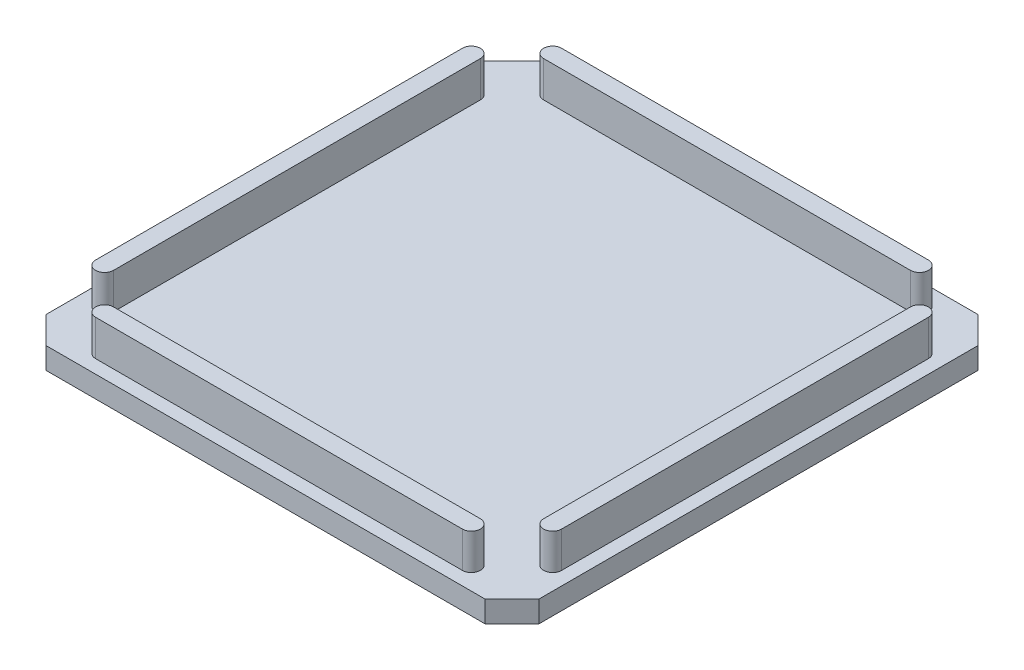
ISO-10303-21;
HEADER;
FILE_DESCRIPTION(('STEP AP214'),'2;1');
FILE_NAME('part.step','',(''),(''),'','','');
FILE_SCHEMA(('AUTOMOTIVE_DESIGN { 1 0 10303 214 1 1 1 1 }'));
ENDSEC;
DATA;
#1=APPLICATION_CONTEXT('core data for automotive mechanical design processes');
#2=APPLICATION_PROTOCOL_DEFINITION('international standard','automotive_design',2000,#1);
#3=PRODUCT_CONTEXT('',#1,'mechanical');
#4=PRODUCT('Part','Part','',(#3));
#5=PRODUCT_RELATED_PRODUCT_CATEGORY('part','',(#4));
#6=PRODUCT_DEFINITION_FORMATION('','',#4);
#7=PRODUCT_DEFINITION_CONTEXT('part definition',#1,'design');
#8=PRODUCT_DEFINITION('design','',#6,#7);
#9=PRODUCT_DEFINITION_SHAPE('','',#8);
#10=(LENGTH_UNIT() NAMED_UNIT(*) SI_UNIT(.MILLI.,.METRE.));
#11=(NAMED_UNIT(*) PLANE_ANGLE_UNIT() SI_UNIT($,.RADIAN.));
#12=(NAMED_UNIT(*) SI_UNIT($,.STERADIAN.) SOLID_ANGLE_UNIT());
#13=UNCERTAINTY_MEASURE_WITH_UNIT(LENGTH_MEASURE(1.E-05),#10,'distance_accuracy_value','');
#14=(GEOMETRIC_REPRESENTATION_CONTEXT(3) GLOBAL_UNCERTAINTY_ASSIGNED_CONTEXT((#13)) GLOBAL_UNIT_ASSIGNED_CONTEXT((#10,
#11,#12)) REPRESENTATION_CONTEXT('',''));
#15=CARTESIAN_POINT('',(0.,0.,0.));
#16=DIRECTION('',(0.,0.,1.));
#17=DIRECTION('',(1.,0.,0.));
#18=AXIS2_PLACEMENT_3D('',#15,#16,#17);
#19=CARTESIAN_POINT('',(0.,2.4,0.));
#20=DIRECTION('',(0.,-1.,0.));
#21=DIRECTION('',(0.,0.,-1.));
#22=AXIS2_PLACEMENT_3D('',#19,#20,#21);
#23=PLANE('',#22);
#24=CARTESIAN_POINT('',(25.0000000000001,2.4,-20.4655702709571));
#25=DIRECTION('',(0.,1.,0.));
#26=DIRECTION('',(0.,0.,-1.));
#27=AXIS2_PLACEMENT_3D('',#24,#25,#26);
#28=CIRCLE('',#27,1.);
#29=CARTESIAN_POINT('',(26.0000000000001,2.4,-20.4655702709571));
#30=VERTEX_POINT('',#29);
#31=CARTESIAN_POINT('',(24.0000000000001,2.4,-20.4655702709571));
#32=VERTEX_POINT('',#31);
#33=EDGE_CURVE('E225',#30,#32,#28,.T.);
#34=ORIENTED_EDGE('',*,*,#33,.F.);
#35=DIRECTION('',(0.,0.,-1.));
#36=VECTOR('',#35,1.);
#37=CARTESIAN_POINT('',(26.0000000000001,2.4,-20.4655702709571));
#38=LINE('',#37,#36);
#39=CARTESIAN_POINT('',(25.9999999999999,2.4,20.4655702709575));
#40=VERTEX_POINT('',#39);
#41=EDGE_CURVE('E241',#40,#30,#38,.T.);
#42=ORIENTED_EDGE('',*,*,#41,.F.);
#43=CARTESIAN_POINT('',(24.9999999999999,2.4,20.4655702709575));
#44=DIRECTION('',(0.,1.,0.));
#45=DIRECTION('',(0.,0.,1.));
#46=AXIS2_PLACEMENT_3D('',#43,#44,#45);
#47=CIRCLE('',#46,1.);
#48=CARTESIAN_POINT('',(23.9999999999999,2.4,20.4655702709575));
#49=VERTEX_POINT('',#48);
#50=EDGE_CURVE('E254',#49,#40,#47,.T.);
#51=ORIENTED_EDGE('',*,*,#50,.F.);
#52=DIRECTION('',(0.,0.,1.));
#53=VECTOR('',#52,1.);
#54=CARTESIAN_POINT('',(24.0000000000001,2.4,-20.4655702709571));
#55=LINE('',#54,#53);
#56=EDGE_CURVE('E230',#32,#49,#55,.T.);
#57=ORIENTED_EDGE('',*,*,#56,.F.);
#58=EDGE_LOOP('',(#34,#42,#51,#57));
#59=FACE_BOUND('',#58,.T.);
#60=CARTESIAN_POINT('',(-25.,2.4,20.4655702709573));
#61=DIRECTION('',(0.,1.,0.));
#62=DIRECTION('',(0.,0.,-1.));
#63=AXIS2_PLACEMENT_3D('',#60,#61,#62);
#64=CIRCLE('',#63,1.);
#65=CARTESIAN_POINT('',(-26.,2.4,20.4655702709573));
#66=VERTEX_POINT('',#65);
#67=CARTESIAN_POINT('',(-24.,2.4,20.4655702709573));
#68=VERTEX_POINT('',#67);
#69=EDGE_CURVE('E321',#66,#68,#64,.T.);
#70=ORIENTED_EDGE('',*,*,#69,.F.);
#71=DIRECTION('',(0.,0.,1.));
#72=VECTOR('',#71,1.);
#73=CARTESIAN_POINT('',(-26.,2.4,20.4655702709573));
#74=LINE('',#73,#72);
#75=CARTESIAN_POINT('',(-26.,2.4,-20.4655702709573));
#76=VERTEX_POINT('',#75);
#77=EDGE_CURVE('E327',#76,#66,#74,.T.);
#78=ORIENTED_EDGE('',*,*,#77,.F.);
#79=CARTESIAN_POINT('',(-25.,2.4,-20.4655702709573));
#80=DIRECTION('',(0.,1.,0.));
#81=DIRECTION('',(0.,0.,1.));
#82=AXIS2_PLACEMENT_3D('',#79,#80,#81);
#83=CIRCLE('',#82,1.);
#84=CARTESIAN_POINT('',(-24.,2.4,-20.4655702709573));
#85=VERTEX_POINT('',#84);
#86=EDGE_CURVE('E344',#85,#76,#83,.T.);
#87=ORIENTED_EDGE('',*,*,#86,.F.);
#88=DIRECTION('',(0.,0.,-1.));
#89=VECTOR('',#88,1.);
#90=CARTESIAN_POINT('',(-24.,2.4,20.4655702709573));
#91=LINE('',#90,#89);
#92=EDGE_CURVE('E340',#68,#85,#91,.T.);
#93=ORIENTED_EDGE('',*,*,#92,.F.);
#94=EDGE_LOOP('',(#70,#78,#87,#93));
#95=FACE_BOUND('',#94,.T.);
#96=DIRECTION('',(0.,0.,1.));
#97=VECTOR('',#96,1.);
#98=CARTESIAN_POINT('',(-27.5,2.4,24.5));
#99=LINE('',#98,#97);
#100=CARTESIAN_POINT('',(-27.5,2.4,-24.5));
#101=VERTEX_POINT('',#100);
#102=CARTESIAN_POINT('',(-27.5,2.4,24.5));
#103=VERTEX_POINT('',#102);
#104=EDGE_CURVE('E367',#101,#103,#99,.T.);
#105=ORIENTED_EDGE('',*,*,#104,.T.);
#106=DIRECTION('',(0.707106781186548,0.,0.707106781186548));
#107=VECTOR('',#106,1.);
#108=CARTESIAN_POINT('',(-27.5,2.4,24.5));
#109=LINE('',#108,#107);
#110=CARTESIAN_POINT('',(-24.5,2.4,27.5));
#111=VERTEX_POINT('',#110);
#112=EDGE_CURVE('E371',#103,#111,#109,.T.);
#113=ORIENTED_EDGE('',*,*,#112,.T.);
#114=DIRECTION('',(1.,0.,0.));
#115=VECTOR('',#114,1.);
#116=CARTESIAN_POINT('',(-24.5,2.4,27.5));
#117=LINE('',#116,#115);
#118=CARTESIAN_POINT('',(24.5,2.4,27.5));
#119=VERTEX_POINT('',#118);
#120=EDGE_CURVE('E375',#111,#119,#117,.T.);
#121=ORIENTED_EDGE('',*,*,#120,.T.);
#122=DIRECTION('',(0.707106781186548,0.,-0.707106781186548));
#123=VECTOR('',#122,1.);
#124=CARTESIAN_POINT('',(24.5,2.4,27.5));
#125=LINE('',#124,#123);
#126=CARTESIAN_POINT('',(27.5,2.4,24.5));
#127=VERTEX_POINT('',#126);
#128=EDGE_CURVE('E378',#119,#127,#125,.T.);
#129=ORIENTED_EDGE('',*,*,#128,.T.);
#130=DIRECTION('',(0.,0.,-1.));
#131=VECTOR('',#130,1.);
#132=CARTESIAN_POINT('',(27.5,2.4,24.5));
#133=LINE('',#132,#131);
#134=CARTESIAN_POINT('',(27.5,2.4,-24.5));
#135=VERTEX_POINT('',#134);
#136=EDGE_CURVE('E381',#127,#135,#133,.T.);
#137=ORIENTED_EDGE('',*,*,#136,.T.);
#138=DIRECTION('',(-0.707106781186548,0.,-0.707106781186548));
#139=VECTOR('',#138,1.);
#140=CARTESIAN_POINT('',(24.5,2.4,-27.5));
#141=LINE('',#140,#139);
#142=CARTESIAN_POINT('',(24.5,2.4,-27.5));
#143=VERTEX_POINT('',#142);
#144=EDGE_CURVE('E384',#135,#143,#141,.T.);
#145=ORIENTED_EDGE('',*,*,#144,.T.);
#146=DIRECTION('',(-1.,0.,0.));
#147=VECTOR('',#146,1.);
#148=CARTESIAN_POINT('',(-24.5,2.4,-27.5));
#149=LINE('',#148,#147);
#150=CARTESIAN_POINT('',(-24.5,2.4,-27.5));
#151=VERTEX_POINT('',#150);
#152=EDGE_CURVE('E387',#143,#151,#149,.T.);
#153=ORIENTED_EDGE('',*,*,#152,.T.);
#154=DIRECTION('',(-0.707106781186548,0.,0.707106781186548));
#155=VECTOR('',#154,1.);
#156=CARTESIAN_POINT('',(-27.5,2.4,-24.5));
#157=LINE('',#156,#155);
#158=EDGE_CURVE('E390',#151,#101,#157,.T.);
#159=ORIENTED_EDGE('',*,*,#158,.T.);
#160=EDGE_LOOP('',(#105,#113,#121,#129,#137,#145,#153,#159));
#161=FACE_BOUND('',#160,.T.);
#162=CARTESIAN_POINT('',(-20.4655702709572,2.4,-25.0000000000001));
#163=DIRECTION('',(0.,1.,0.));
#164=DIRECTION('',(0.,0.,-1.));
#165=AXIS2_PLACEMENT_3D('',#162,#163,#164);
#166=CIRCLE('',#165,1.);
#167=CARTESIAN_POINT('',(-20.4655702709572,2.4,-26.0000000000001));
#168=VERTEX_POINT('',#167);
#169=CARTESIAN_POINT('',(-20.4655702709572,2.4,-24.0000000000001));
#170=VERTEX_POINT('',#169);
#171=EDGE_CURVE('E276',#168,#170,#166,.T.);
#172=ORIENTED_EDGE('',*,*,#171,.F.);
#173=DIRECTION('',(-1.,0.,0.));
#174=VECTOR('',#173,1.);
#175=CARTESIAN_POINT('',(-20.4655702709572,2.4,-26.0000000000001));
#176=LINE('',#175,#174);
#177=CARTESIAN_POINT('',(20.4655702709574,2.4,-25.9999999999999));
#178=VERTEX_POINT('',#177);
#179=EDGE_CURVE('E282',#178,#168,#176,.T.);
#180=ORIENTED_EDGE('',*,*,#179,.F.);
#181=CARTESIAN_POINT('',(20.4655702709574,2.4,-24.9999999999999));
#182=DIRECTION('',(0.,1.,0.));
#183=DIRECTION('',(0.,0.,1.));
#184=AXIS2_PLACEMENT_3D('',#181,#182,#183);
#185=CIRCLE('',#184,1.);
#186=CARTESIAN_POINT('',(20.4655702709574,2.4,-23.9999999999999));
#187=VERTEX_POINT('',#186);
#188=EDGE_CURVE('E299',#187,#178,#185,.T.);
#189=ORIENTED_EDGE('',*,*,#188,.F.);
#190=DIRECTION('',(1.,0.,0.));
#191=VECTOR('',#190,1.);
#192=CARTESIAN_POINT('',(-20.4655702709572,2.4,-24.0000000000001));
#193=LINE('',#192,#191);
#194=EDGE_CURVE('E295',#170,#187,#193,.T.);
#195=ORIENTED_EDGE('',*,*,#194,.F.);
#196=EDGE_LOOP('',(#172,#180,#189,#195));
#197=FACE_BOUND('',#196,.T.);
#198=CARTESIAN_POINT('',(20.465570270957,2.4,25.0000000000002));
#199=DIRECTION('',(0.,1.,0.));
#200=DIRECTION('',(0.,0.,-1.));
#201=AXIS2_PLACEMENT_3D('',#198,#199,#200);
#202=CIRCLE('',#201,1.);
#203=CARTESIAN_POINT('',(20.465570270957,2.4,26.0000000000002));
#204=VERTEX_POINT('',#203);
#205=CARTESIAN_POINT('',(20.465570270957,2.4,24.0000000000002));
#206=VERTEX_POINT('',#205);
#207=EDGE_CURVE('E223',#204,#206,#202,.T.);
#208=ORIENTED_EDGE('',*,*,#207,.F.);
#209=DIRECTION('',(1.,0.,0.));
#210=VECTOR('',#209,1.);
#211=CARTESIAN_POINT('',(20.465570270957,2.4,26.0000000000002));
#212=LINE('',#211,#210);
#213=CARTESIAN_POINT('',(-20.4655702709576,2.4,25.9999999999998));
#214=VERTEX_POINT('',#213);
#215=EDGE_CURVE('E220',#214,#204,#212,.T.);
#216=ORIENTED_EDGE('',*,*,#215,.F.);
#217=CARTESIAN_POINT('',(-20.4655702709576,2.4,24.9999999999998));
#218=DIRECTION('',(0.,1.,0.));
#219=DIRECTION('',(0.,0.,1.));
#220=AXIS2_PLACEMENT_3D('',#217,#218,#219);
#221=CIRCLE('',#220,1.);
#222=CARTESIAN_POINT('',(-20.4655702709576,2.4,23.9999999999998));
#223=VERTEX_POINT('',#222);
#224=EDGE_CURVE('E60',#223,#214,#221,.T.);
#225=ORIENTED_EDGE('',*,*,#224,.F.);
#226=DIRECTION('',(-1.,0.,0.));
#227=VECTOR('',#226,1.);
#228=CARTESIAN_POINT('',(20.465570270957,2.4,24.0000000000002));
#229=LINE('',#228,#227);
#230=EDGE_CURVE('E55',#206,#223,#229,.T.);
#231=ORIENTED_EDGE('',*,*,#230,.F.);
#232=EDGE_LOOP('',(#208,#216,#225,#231));
#233=FACE_BOUND('',#232,.T.);
#234=ADVANCED_FACE('F39',(#59,#95,#161,#197,#233),#23,.F.);
#235=CARTESIAN_POINT('',(-27.5,2.4,24.5));
#236=DIRECTION('',(1.,0.,0.));
#237=DIRECTION('',(0.,0.,-1.));
#238=AXIS2_PLACEMENT_3D('',#235,#236,#237);
#239=PLANE('',#238);
#240=DIRECTION('',(0.,0.,1.));
#241=VECTOR('',#240,1.);
#242=CARTESIAN_POINT('',(-27.5,0.,24.5));
#243=LINE('',#242,#241);
#244=CARTESIAN_POINT('',(-27.5,0.,-24.5));
#245=VERTEX_POINT('',#244);
#246=CARTESIAN_POINT('',(-27.5,0.,24.5));
#247=VERTEX_POINT('',#246);
#248=EDGE_CURVE('E366',#245,#247,#243,.T.);
#249=ORIENTED_EDGE('',*,*,#248,.T.);
#250=DIRECTION('',(0.,-1.,0.));
#251=VECTOR('',#250,1.);
#252=CARTESIAN_POINT('',(-27.5,2.4,24.5));
#253=LINE('',#252,#251);
#254=EDGE_CURVE('E11',#103,#247,#253,.T.);
#255=ORIENTED_EDGE('',*,*,#254,.F.);
#256=ORIENTED_EDGE('',*,*,#104,.F.);
#257=DIRECTION('',(0.,-1.,0.));
#258=VECTOR('',#257,1.);
#259=CARTESIAN_POINT('',(-27.5,2.4,-24.5));
#260=LINE('',#259,#258);
#261=EDGE_CURVE('E393',#101,#245,#260,.T.);
#262=ORIENTED_EDGE('',*,*,#261,.T.);
#263=EDGE_LOOP('',(#249,#255,#256,#262));
#264=FACE_BOUND('',#263,.T.);
#265=ADVANCED_FACE('F41',(#264),#239,.F.);
#266=CARTESIAN_POINT('',(-27.5,2.4,24.5));
#267=DIRECTION('',(0.707106781186548,0.,-0.707106781186548));
#268=DIRECTION('',(-0.707106781186548,0.,-0.707106781186548));
#269=AXIS2_PLACEMENT_3D('',#266,#267,#268);
#270=PLANE('',#269);
#271=DIRECTION('',(0.707106781186548,0.,0.707106781186548));
#272=VECTOR('',#271,1.);
#273=CARTESIAN_POINT('',(-27.5,0.,24.5));
#274=LINE('',#273,#272);
#275=CARTESIAN_POINT('',(-24.5,0.,27.5));
#276=VERTEX_POINT('',#275);
#277=EDGE_CURVE('E397',#247,#276,#274,.T.);
#278=ORIENTED_EDGE('',*,*,#277,.T.);
#279=DIRECTION('',(0.,-1.,0.));
#280=VECTOR('',#279,1.);
#281=CARTESIAN_POINT('',(-24.5,2.4,27.5));
#282=LINE('',#281,#280);
#283=EDGE_CURVE('E48',#111,#276,#282,.T.);
#284=ORIENTED_EDGE('',*,*,#283,.F.);
#285=ORIENTED_EDGE('',*,*,#112,.F.);
#286=ORIENTED_EDGE('',*,*,#254,.T.);
#287=EDGE_LOOP('',(#278,#284,#285,#286));
#288=FACE_BOUND('',#287,.T.);
#289=ADVANCED_FACE('F468',(#288),#270,.F.);
#290=CARTESIAN_POINT('',(-24.5,2.4,27.5));
#291=DIRECTION('',(0.,0.,-1.));
#292=DIRECTION('',(-1.,0.,0.));
#293=AXIS2_PLACEMENT_3D('',#290,#291,#292);
#294=PLANE('',#293);
#295=DIRECTION('',(1.,0.,0.));
#296=VECTOR('',#295,1.);
#297=CARTESIAN_POINT('',(-24.5,0.,27.5));
#298=LINE('',#297,#296);
#299=CARTESIAN_POINT('',(24.5,0.,27.5));
#300=VERTEX_POINT('',#299);
#301=EDGE_CURVE('E400',#276,#300,#298,.T.);
#302=ORIENTED_EDGE('',*,*,#301,.T.);
#303=DIRECTION('',(0.,-1.,0.));
#304=VECTOR('',#303,1.);
#305=CARTESIAN_POINT('',(24.5,2.4,27.5));
#306=LINE('',#305,#304);
#307=EDGE_CURVE('E436',#119,#300,#306,.T.);
#308=ORIENTED_EDGE('',*,*,#307,.F.);
#309=ORIENTED_EDGE('',*,*,#120,.F.);
#310=ORIENTED_EDGE('',*,*,#283,.T.);
#311=EDGE_LOOP('',(#302,#308,#309,#310));
#312=FACE_BOUND('',#311,.T.);
#313=ADVANCED_FACE('F445',(#312),#294,.F.);
#314=CARTESIAN_POINT('',(24.5,2.4,27.5));
#315=DIRECTION('',(-0.707106781186548,0.,-0.707106781186548));
#316=DIRECTION('',(-0.707106781186548,0.,0.707106781186548));
#317=AXIS2_PLACEMENT_3D('',#314,#315,#316);
#318=PLANE('',#317);
#319=DIRECTION('',(0.707106781186548,0.,-0.707106781186548));
#320=VECTOR('',#319,1.);
#321=CARTESIAN_POINT('',(24.5,0.,27.5));
#322=LINE('',#321,#320);
#323=CARTESIAN_POINT('',(27.5,0.,24.5));
#324=VERTEX_POINT('',#323);
#325=EDGE_CURVE('E403',#300,#324,#322,.T.);
#326=ORIENTED_EDGE('',*,*,#325,.T.);
#327=DIRECTION('',(0.,-1.,0.));
#328=VECTOR('',#327,1.);
#329=CARTESIAN_POINT('',(27.5,2.4,24.5));
#330=LINE('',#329,#328);
#331=EDGE_CURVE('E432',#127,#324,#330,.T.);
#332=ORIENTED_EDGE('',*,*,#331,.F.);
#333=ORIENTED_EDGE('',*,*,#128,.F.);
#334=ORIENTED_EDGE('',*,*,#307,.T.);
#335=EDGE_LOOP('',(#326,#332,#333,#334));
#336=FACE_BOUND('',#335,.T.);
#337=ADVANCED_FACE('F456',(#336),#318,.F.);
#338=CARTESIAN_POINT('',(27.5,2.4,24.5));
#339=DIRECTION('',(-1.,0.,0.));
#340=DIRECTION('',(0.,0.,1.));
#341=AXIS2_PLACEMENT_3D('',#338,#339,#340);
#342=PLANE('',#341);
#343=DIRECTION('',(0.,0.,-1.));
#344=VECTOR('',#343,1.);
#345=CARTESIAN_POINT('',(27.5,0.,24.5));
#346=LINE('',#345,#344);
#347=CARTESIAN_POINT('',(27.5,0.,-24.5));
#348=VERTEX_POINT('',#347);
#349=EDGE_CURVE('E406',#324,#348,#346,.T.);
#350=ORIENTED_EDGE('',*,*,#349,.T.);
#351=DIRECTION('',(0.,-1.,0.));
#352=VECTOR('',#351,1.);
#353=CARTESIAN_POINT('',(27.5,2.4,-24.5));
#354=LINE('',#353,#352);
#355=EDGE_CURVE('E428',#135,#348,#354,.T.);
#356=ORIENTED_EDGE('',*,*,#355,.F.);
#357=ORIENTED_EDGE('',*,*,#136,.F.);
#358=ORIENTED_EDGE('',*,*,#331,.T.);
#359=EDGE_LOOP('',(#350,#356,#357,#358));
#360=FACE_BOUND('',#359,.T.);
#361=ADVANCED_FACE('F460',(#360),#342,.F.);
#362=CARTESIAN_POINT('',(24.5,2.4,-27.5));
#363=DIRECTION('',(-0.707106781186548,0.,0.707106781186548));
#364=DIRECTION('',(0.707106781186548,0.,0.707106781186548));
#365=AXIS2_PLACEMENT_3D('',#362,#363,#364);
#366=PLANE('',#365);
#367=DIRECTION('',(-0.707106781186548,0.,-0.707106781186548));
#368=VECTOR('',#367,1.);
#369=CARTESIAN_POINT('',(24.5,0.,-27.5));
#370=LINE('',#369,#368);
#371=CARTESIAN_POINT('',(24.5,0.,-27.5));
#372=VERTEX_POINT('',#371);
#373=EDGE_CURVE('E409',#348,#372,#370,.T.);
#374=ORIENTED_EDGE('',*,*,#373,.T.);
#375=DIRECTION('',(0.,-1.,0.));
#376=VECTOR('',#375,1.);
#377=CARTESIAN_POINT('',(24.5,2.4,-27.5));
#378=LINE('',#377,#376);
#379=EDGE_CURVE('E424',#143,#372,#378,.T.);
#380=ORIENTED_EDGE('',*,*,#379,.F.);
#381=ORIENTED_EDGE('',*,*,#144,.F.);
#382=ORIENTED_EDGE('',*,*,#355,.T.);
#383=EDGE_LOOP('',(#374,#380,#381,#382));
#384=FACE_BOUND('',#383,.T.);
#385=ADVANCED_FACE('F481',(#384),#366,.F.);
#386=CARTESIAN_POINT('',(-24.5,2.4,-27.5));
#387=DIRECTION('',(0.,0.,1.));
#388=DIRECTION('',(1.,0.,0.));
#389=AXIS2_PLACEMENT_3D('',#386,#387,#388);
#390=PLANE('',#389);
#391=DIRECTION('',(-1.,0.,0.));
#392=VECTOR('',#391,1.);
#393=CARTESIAN_POINT('',(-24.5,0.,-27.5));
#394=LINE('',#393,#392);
#395=CARTESIAN_POINT('',(-24.5,0.,-27.5));
#396=VERTEX_POINT('',#395);
#397=EDGE_CURVE('E412',#372,#396,#394,.T.);
#398=ORIENTED_EDGE('',*,*,#397,.T.);
#399=DIRECTION('',(0.,-1.,0.));
#400=VECTOR('',#399,1.);
#401=CARTESIAN_POINT('',(-24.5,2.4,-27.5));
#402=LINE('',#401,#400);
#403=EDGE_CURVE('E420',#151,#396,#402,.T.);
#404=ORIENTED_EDGE('',*,*,#403,.F.);
#405=ORIENTED_EDGE('',*,*,#152,.F.);
#406=ORIENTED_EDGE('',*,*,#379,.T.);
#407=EDGE_LOOP('',(#398,#404,#405,#406));
#408=FACE_BOUND('',#407,.T.);
#409=ADVANCED_FACE('F479',(#408),#390,.F.);
#410=CARTESIAN_POINT('',(-27.5,2.4,-24.5));
#411=DIRECTION('',(0.707106781186548,0.,0.707106781186548));
#412=DIRECTION('',(0.707106781186548,0.,-0.707106781186548));
#413=AXIS2_PLACEMENT_3D('',#410,#411,#412);
#414=PLANE('',#413);
#415=DIRECTION('',(-0.707106781186548,0.,0.707106781186548));
#416=VECTOR('',#415,1.);
#417=CARTESIAN_POINT('',(-27.5,0.,-24.5));
#418=LINE('',#417,#416);
#419=EDGE_CURVE('E372',#396,#245,#418,.T.);
#420=ORIENTED_EDGE('',*,*,#419,.T.);
#421=ORIENTED_EDGE('',*,*,#261,.F.);
#422=ORIENTED_EDGE('',*,*,#158,.F.);
#423=ORIENTED_EDGE('',*,*,#403,.T.);
#424=EDGE_LOOP('',(#420,#421,#422,#423));
#425=FACE_BOUND('',#424,.T.);
#426=ADVANCED_FACE('F474',(#425),#414,.F.);
#427=CARTESIAN_POINT('',(0.,0.,0.));
#428=DIRECTION('',(0.,-1.,0.));
#429=DIRECTION('',(0.,0.,-1.));
#430=AXIS2_PLACEMENT_3D('',#427,#428,#429);
#431=PLANE('',#430);
#432=ORIENTED_EDGE('',*,*,#248,.F.);
#433=ORIENTED_EDGE('',*,*,#419,.F.);
#434=ORIENTED_EDGE('',*,*,#397,.F.);
#435=ORIENTED_EDGE('',*,*,#373,.F.);
#436=ORIENTED_EDGE('',*,*,#349,.F.);
#437=ORIENTED_EDGE('',*,*,#325,.F.);
#438=ORIENTED_EDGE('',*,*,#301,.F.);
#439=ORIENTED_EDGE('',*,*,#277,.F.);
#440=EDGE_LOOP('',(#432,#433,#434,#435,#436,#437,#438,#439));
#441=FACE_BOUND('',#440,.T.);
#442=ADVANCED_FACE('F451',(#441),#431,.T.);
#443=CARTESIAN_POINT('',(-25.,6.4,20.4655702709573));
#444=DIRECTION('',(0.,-1.,0.));
#445=DIRECTION('',(0.,0.,-1.));
#446=AXIS2_PLACEMENT_3D('',#443,#444,#445);
#447=CYLINDRICAL_SURFACE('',#446,1.);
#448=ORIENTED_EDGE('',*,*,#69,.T.);
#449=DIRECTION('',(0.,-1.,0.));
#450=VECTOR('',#449,1.);
#451=CARTESIAN_POINT('',(-24.,6.4,20.4655702709573));
#452=LINE('',#451,#450);
#453=CARTESIAN_POINT('',(-24.,6.4,20.4655702709573));
#454=VERTEX_POINT('',#453);
#455=EDGE_CURVE('E362',#454,#68,#452,.T.);
#456=ORIENTED_EDGE('',*,*,#455,.F.);
#457=CARTESIAN_POINT('',(-25.,6.4,20.4655702709573));
#458=DIRECTION('',(0.,1.,0.));
#459=DIRECTION('',(0.,0.,-1.));
#460=AXIS2_PLACEMENT_3D('',#457,#458,#459);
#461=CIRCLE('',#460,1.);
#462=CARTESIAN_POINT('',(-26.,6.4,20.4655702709573));
#463=VERTEX_POINT('',#462);
#464=EDGE_CURVE('E322',#463,#454,#461,.T.);
#465=ORIENTED_EDGE('',*,*,#464,.F.);
#466=DIRECTION('',(0.,-1.,0.));
#467=VECTOR('',#466,1.);
#468=CARTESIAN_POINT('',(-26.,6.4,20.4655702709573));
#469=LINE('',#468,#467);
#470=EDGE_CURVE('E336',#463,#66,#469,.T.);
#471=ORIENTED_EDGE('',*,*,#470,.T.);
#472=EDGE_LOOP('',(#448,#456,#465,#471));
#473=FACE_BOUND('',#472,.T.);
#474=ADVANCED_FACE('F499',(#473),#447,.T.);
#475=CARTESIAN_POINT('',(-24.,6.4,20.4655702709573));
#476=DIRECTION('',(-1.,0.,0.));
#477=DIRECTION('',(0.,0.,1.));
#478=AXIS2_PLACEMENT_3D('',#475,#476,#477);
#479=PLANE('',#478);
#480=ORIENTED_EDGE('',*,*,#92,.T.);
#481=DIRECTION('',(0.,-1.,0.));
#482=VECTOR('',#481,1.);
#483=CARTESIAN_POINT('',(-24.,6.4,-20.4655702709573));
#484=LINE('',#483,#482);
#485=CARTESIAN_POINT('',(-24.,6.4,-20.4655702709573));
#486=VERTEX_POINT('',#485);
#487=EDGE_CURVE('E358',#486,#85,#484,.T.);
#488=ORIENTED_EDGE('',*,*,#487,.F.);
#489=DIRECTION('',(0.,0.,-1.));
#490=VECTOR('',#489,1.);
#491=CARTESIAN_POINT('',(-24.,6.4,20.4655702709573));
#492=LINE('',#491,#490);
#493=EDGE_CURVE('E326',#454,#486,#492,.T.);
#494=ORIENTED_EDGE('',*,*,#493,.F.);
#495=ORIENTED_EDGE('',*,*,#455,.T.);
#496=EDGE_LOOP('',(#480,#488,#494,#495));
#497=FACE_BOUND('',#496,.T.);
#498=ADVANCED_FACE('F518',(#497),#479,.F.);
#499=CARTESIAN_POINT('',(-25.,6.4,-20.4655702709573));
#500=DIRECTION('',(0.,-1.,0.));
#501=DIRECTION('',(0.,0.,-1.));
#502=AXIS2_PLACEMENT_3D('',#499,#500,#501);
#503=CYLINDRICAL_SURFACE('',#502,1.);
#504=ORIENTED_EDGE('',*,*,#86,.T.);
#505=DIRECTION('',(0.,-1.,0.));
#506=VECTOR('',#505,1.);
#507=CARTESIAN_POINT('',(-26.,6.4,-20.4655702709573));
#508=LINE('',#507,#506);
#509=CARTESIAN_POINT('',(-26.,6.4,-20.4655702709573));
#510=VERTEX_POINT('',#509);
#511=EDGE_CURVE('E354',#510,#76,#508,.T.);
#512=ORIENTED_EDGE('',*,*,#511,.F.);
#513=CARTESIAN_POINT('',(-25.,6.4,-20.4655702709573));
#514=DIRECTION('',(0.,1.,0.));
#515=DIRECTION('',(0.,0.,1.));
#516=AXIS2_PLACEMENT_3D('',#513,#514,#515);
#517=CIRCLE('',#516,1.);
#518=EDGE_CURVE('E330',#486,#510,#517,.T.);
#519=ORIENTED_EDGE('',*,*,#518,.F.);
#520=ORIENTED_EDGE('',*,*,#487,.T.);
#521=EDGE_LOOP('',(#504,#512,#519,#520));
#522=FACE_BOUND('',#521,.T.);
#523=ADVANCED_FACE('F525',(#522),#503,.T.);
#524=CARTESIAN_POINT('',(-26.,6.4,20.4655702709573));
#525=DIRECTION('',(1.,0.,0.));
#526=DIRECTION('',(0.,0.,-1.));
#527=AXIS2_PLACEMENT_3D('',#524,#525,#526);
#528=PLANE('',#527);
#529=ORIENTED_EDGE('',*,*,#77,.T.);
#530=ORIENTED_EDGE('',*,*,#470,.F.);
#531=DIRECTION('',(0.,0.,1.));
#532=VECTOR('',#531,1.);
#533=CARTESIAN_POINT('',(-26.,6.4,20.4655702709573));
#534=LINE('',#533,#532);
#535=EDGE_CURVE('E333',#510,#463,#534,.T.);
#536=ORIENTED_EDGE('',*,*,#535,.F.);
#537=ORIENTED_EDGE('',*,*,#511,.T.);
#538=EDGE_LOOP('',(#529,#530,#536,#537));
#539=FACE_BOUND('',#538,.T.);
#540=ADVANCED_FACE('F532',(#539),#528,.F.);
#541=CARTESIAN_POINT('',(-25.,6.4,20.4655702709573));
#542=DIRECTION('',(0.,-1.,0.));
#543=DIRECTION('',(0.,0.,-1.));
#544=AXIS2_PLACEMENT_3D('',#541,#542,#543);
#545=PLANE('',#544);
#546=ORIENTED_EDGE('',*,*,#464,.T.);
#547=ORIENTED_EDGE('',*,*,#493,.T.);
#548=ORIENTED_EDGE('',*,*,#518,.T.);
#549=ORIENTED_EDGE('',*,*,#535,.T.);
#550=EDGE_LOOP('',(#546,#547,#548,#549));
#551=FACE_BOUND('',#550,.T.);
#552=ADVANCED_FACE('F540',(#551),#545,.F.);
#553=CARTESIAN_POINT('',(-20.4655702709572,6.4,-25.0000000000001));
#554=DIRECTION('',(0.,-1.,0.));
#555=DIRECTION('',(0.,0.,-1.));
#556=AXIS2_PLACEMENT_3D('',#553,#554,#555);
#557=CYLINDRICAL_SURFACE('',#556,1.);
#558=ORIENTED_EDGE('',*,*,#171,.T.);
#559=DIRECTION('',(0.,-1.,0.));
#560=VECTOR('',#559,1.);
#561=CARTESIAN_POINT('',(-20.4655702709572,6.4,-24.0000000000001));
#562=LINE('',#561,#560);
#563=CARTESIAN_POINT('',(-20.4655702709572,6.4,-24.0000000000001));
#564=VERTEX_POINT('',#563);
#565=EDGE_CURVE('E317',#564,#170,#562,.T.);
#566=ORIENTED_EDGE('',*,*,#565,.F.);
#567=CARTESIAN_POINT('',(-20.4655702709572,6.4,-25.0000000000001));
#568=DIRECTION('',(0.,1.,0.));
#569=DIRECTION('',(0.,0.,-1.));
#570=AXIS2_PLACEMENT_3D('',#567,#568,#569);
#571=CIRCLE('',#570,1.);
#572=CARTESIAN_POINT('',(-20.4655702709572,6.4,-26.0000000000001));
#573=VERTEX_POINT('',#572);
#574=EDGE_CURVE('E277',#573,#564,#571,.T.);
#575=ORIENTED_EDGE('',*,*,#574,.F.);
#576=DIRECTION('',(0.,-1.,0.));
#577=VECTOR('',#576,1.);
#578=CARTESIAN_POINT('',(-20.4655702709572,6.4,-26.0000000000001));
#579=LINE('',#578,#577);
#580=EDGE_CURVE('E291',#573,#168,#579,.T.);
#581=ORIENTED_EDGE('',*,*,#580,.T.);
#582=EDGE_LOOP('',(#558,#566,#575,#581));
#583=FACE_BOUND('',#582,.T.);
#584=ADVANCED_FACE('F548',(#583),#557,.T.);
#585=CARTESIAN_POINT('',(-20.4655702709572,6.4,-24.0000000000001));
#586=DIRECTION('',(0.,0.,-1.));
#587=DIRECTION('',(-1.,0.,0.));
#588=AXIS2_PLACEMENT_3D('',#585,#586,#587);
#589=PLANE('',#588);
#590=ORIENTED_EDGE('',*,*,#194,.T.);
#591=DIRECTION('',(0.,-1.,0.));
#592=VECTOR('',#591,1.);
#593=CARTESIAN_POINT('',(20.4655702709574,6.4,-23.9999999999999));
#594=LINE('',#593,#592);
#595=CARTESIAN_POINT('',(20.4655702709574,6.4,-23.9999999999999));
#596=VERTEX_POINT('',#595);
#597=EDGE_CURVE('E313',#596,#187,#594,.T.);
#598=ORIENTED_EDGE('',*,*,#597,.F.);
#599=DIRECTION('',(1.,0.,0.));
#600=VECTOR('',#599,1.);
#601=CARTESIAN_POINT('',(-20.4655702709572,6.4,-24.0000000000001));
#602=LINE('',#601,#600);
#603=EDGE_CURVE('E281',#564,#596,#602,.T.);
#604=ORIENTED_EDGE('',*,*,#603,.F.);
#605=ORIENTED_EDGE('',*,*,#565,.T.);
#606=EDGE_LOOP('',(#590,#598,#604,#605));
#607=FACE_BOUND('',#606,.T.);
#608=ADVANCED_FACE('F556',(#607),#589,.F.);
#609=CARTESIAN_POINT('',(20.4655702709574,6.4,-24.9999999999999));
#610=DIRECTION('',(0.,-1.,0.));
#611=DIRECTION('',(0.,0.,-1.));
#612=AXIS2_PLACEMENT_3D('',#609,#610,#611);
#613=CYLINDRICAL_SURFACE('',#612,1.);
#614=ORIENTED_EDGE('',*,*,#188,.T.);
#615=DIRECTION('',(0.,-1.,0.));
#616=VECTOR('',#615,1.);
#617=CARTESIAN_POINT('',(20.4655702709574,6.4,-25.9999999999999));
#618=LINE('',#617,#616);
#619=CARTESIAN_POINT('',(20.4655702709574,6.4,-25.9999999999999));
#620=VERTEX_POINT('',#619);
#621=EDGE_CURVE('E309',#620,#178,#618,.T.);
#622=ORIENTED_EDGE('',*,*,#621,.F.);
#623=CARTESIAN_POINT('',(20.4655702709574,6.4,-24.9999999999999));
#624=DIRECTION('',(0.,1.,0.));
#625=DIRECTION('',(0.,0.,1.));
#626=AXIS2_PLACEMENT_3D('',#623,#624,#625);
#627=CIRCLE('',#626,1.);
#628=EDGE_CURVE('E285',#596,#620,#627,.T.);
#629=ORIENTED_EDGE('',*,*,#628,.F.);
#630=ORIENTED_EDGE('',*,*,#597,.T.);
#631=EDGE_LOOP('',(#614,#622,#629,#630));
#632=FACE_BOUND('',#631,.T.);
#633=ADVANCED_FACE('F564',(#632),#613,.T.);
#634=CARTESIAN_POINT('',(-20.4655702709572,6.4,-26.0000000000001));
#635=DIRECTION('',(0.,0.,1.));
#636=DIRECTION('',(1.,0.,0.));
#637=AXIS2_PLACEMENT_3D('',#634,#635,#636);
#638=PLANE('',#637);
#639=ORIENTED_EDGE('',*,*,#179,.T.);
#640=ORIENTED_EDGE('',*,*,#580,.F.);
#641=DIRECTION('',(-1.,0.,0.));
#642=VECTOR('',#641,1.);
#643=CARTESIAN_POINT('',(-20.4655702709572,6.4,-26.0000000000001));
#644=LINE('',#643,#642);
#645=EDGE_CURVE('E288',#620,#573,#644,.T.);
#646=ORIENTED_EDGE('',*,*,#645,.F.);
#647=ORIENTED_EDGE('',*,*,#621,.T.);
#648=EDGE_LOOP('',(#639,#640,#646,#647));
#649=FACE_BOUND('',#648,.T.);
#650=ADVANCED_FACE('F572',(#649),#638,.F.);
#651=CARTESIAN_POINT('',(-20.4655702709572,6.4,-25.0000000000001));
#652=DIRECTION('',(0.,-1.,0.));
#653=DIRECTION('',(0.,0.,-1.));
#654=AXIS2_PLACEMENT_3D('',#651,#652,#653);
#655=PLANE('',#654);
#656=ORIENTED_EDGE('',*,*,#574,.T.);
#657=ORIENTED_EDGE('',*,*,#603,.T.);
#658=ORIENTED_EDGE('',*,*,#628,.T.);
#659=ORIENTED_EDGE('',*,*,#645,.T.);
#660=EDGE_LOOP('',(#656,#657,#658,#659));
#661=FACE_BOUND('',#660,.T.);
#662=ADVANCED_FACE('F580',(#661),#655,.F.);
#663=CARTESIAN_POINT('',(25.0000000000001,6.4,-20.4655702709571));
#664=DIRECTION('',(0.,-1.,0.));
#665=DIRECTION('',(0.,0.,-1.));
#666=AXIS2_PLACEMENT_3D('',#663,#664,#665);
#667=CYLINDRICAL_SURFACE('',#666,1.);
#668=ORIENTED_EDGE('',*,*,#33,.T.);
#669=DIRECTION('',(0.,-1.,0.));
#670=VECTOR('',#669,1.);
#671=CARTESIAN_POINT('',(24.0000000000001,6.4,-20.4655702709571));
#672=LINE('',#671,#670);
#673=CARTESIAN_POINT('',(24.0000000000001,6.4,-20.4655702709571));
#674=VERTEX_POINT('',#673);
#675=EDGE_CURVE('E272',#674,#32,#672,.T.);
#676=ORIENTED_EDGE('',*,*,#675,.F.);
#677=CARTESIAN_POINT('',(25.0000000000001,6.4,-20.4655702709571));
#678=DIRECTION('',(0.,1.,0.));
#679=DIRECTION('',(0.,0.,-1.));
#680=AXIS2_PLACEMENT_3D('',#677,#678,#679);
#681=CIRCLE('',#680,1.);
#682=CARTESIAN_POINT('',(26.0000000000001,6.4,-20.4655702709571));
#683=VERTEX_POINT('',#682);
#684=EDGE_CURVE('E236',#683,#674,#681,.T.);
#685=ORIENTED_EDGE('',*,*,#684,.F.);
#686=DIRECTION('',(0.,-1.,0.));
#687=VECTOR('',#686,1.);
#688=CARTESIAN_POINT('',(26.0000000000001,6.4,-20.4655702709571));
#689=LINE('',#688,#687);
#690=EDGE_CURVE('E249',#683,#30,#689,.T.);
#691=ORIENTED_EDGE('',*,*,#690,.T.);
#692=EDGE_LOOP('',(#668,#676,#685,#691));
#693=FACE_BOUND('',#692,.T.);
#694=ADVANCED_FACE('F588',(#693),#667,.T.);
#695=CARTESIAN_POINT('',(24.0000000000001,6.4,-20.4655702709571));
#696=DIRECTION('',(1.,0.,0.));
#697=DIRECTION('',(0.,0.,-1.));
#698=AXIS2_PLACEMENT_3D('',#695,#696,#697);
#699=PLANE('',#698);
#700=ORIENTED_EDGE('',*,*,#56,.T.);
#701=DIRECTION('',(0.,-1.,0.));
#702=VECTOR('',#701,1.);
#703=CARTESIAN_POINT('',(23.9999999999999,6.4,20.4655702709575));
#704=LINE('',#703,#702);
#705=CARTESIAN_POINT('',(23.9999999999999,6.4,20.4655702709575));
#706=VERTEX_POINT('',#705);
#707=EDGE_CURVE('E268',#706,#49,#704,.T.);
#708=ORIENTED_EDGE('',*,*,#707,.F.);
#709=DIRECTION('',(0.,0.,1.));
#710=VECTOR('',#709,1.);
#711=CARTESIAN_POINT('',(24.0000000000001,6.4,-20.4655702709571));
#712=LINE('',#711,#710);
#713=EDGE_CURVE('E240',#674,#706,#712,.T.);
#714=ORIENTED_EDGE('',*,*,#713,.F.);
#715=ORIENTED_EDGE('',*,*,#675,.T.);
#716=EDGE_LOOP('',(#700,#708,#714,#715));
#717=FACE_BOUND('',#716,.T.);
#718=ADVANCED_FACE('F596',(#717),#699,.F.);
#719=CARTESIAN_POINT('',(24.9999999999999,6.4,20.4655702709575));
#720=DIRECTION('',(0.,-1.,0.));
#721=DIRECTION('',(0.,0.,-1.));
#722=AXIS2_PLACEMENT_3D('',#719,#720,#721);
#723=CYLINDRICAL_SURFACE('',#722,1.);
#724=ORIENTED_EDGE('',*,*,#50,.T.);
#725=DIRECTION('',(0.,-1.,0.));
#726=VECTOR('',#725,1.);
#727=CARTESIAN_POINT('',(25.9999999999999,6.4,20.4655702709575));
#728=LINE('',#727,#726);
#729=CARTESIAN_POINT('',(25.9999999999999,6.4,20.4655702709575));
#730=VERTEX_POINT('',#729);
#731=EDGE_CURVE('E264',#730,#40,#728,.T.);
#732=ORIENTED_EDGE('',*,*,#731,.F.);
#733=CARTESIAN_POINT('',(24.9999999999999,6.4,20.4655702709575));
#734=DIRECTION('',(0.,1.,0.));
#735=DIRECTION('',(0.,0.,1.));
#736=AXIS2_PLACEMENT_3D('',#733,#734,#735);
#737=CIRCLE('',#736,1.);
#738=EDGE_CURVE('E244',#706,#730,#737,.T.);
#739=ORIENTED_EDGE('',*,*,#738,.F.);
#740=ORIENTED_EDGE('',*,*,#707,.T.);
#741=EDGE_LOOP('',(#724,#732,#739,#740));
#742=FACE_BOUND('',#741,.T.);
#743=ADVANCED_FACE('F604',(#742),#723,.T.);
#744=CARTESIAN_POINT('',(26.0000000000001,6.4,-20.4655702709571));
#745=DIRECTION('',(-1.,0.,0.));
#746=DIRECTION('',(0.,0.,1.));
#747=AXIS2_PLACEMENT_3D('',#744,#745,#746);
#748=PLANE('',#747);
#749=ORIENTED_EDGE('',*,*,#41,.T.);
#750=ORIENTED_EDGE('',*,*,#690,.F.);
#751=DIRECTION('',(0.,0.,-1.));
#752=VECTOR('',#751,1.);
#753=CARTESIAN_POINT('',(26.0000000000001,6.4,-20.4655702709571));
#754=LINE('',#753,#752);
#755=EDGE_CURVE('E247',#730,#683,#754,.T.);
#756=ORIENTED_EDGE('',*,*,#755,.F.);
#757=ORIENTED_EDGE('',*,*,#731,.T.);
#758=EDGE_LOOP('',(#749,#750,#756,#757));
#759=FACE_BOUND('',#758,.T.);
#760=ADVANCED_FACE('F612',(#759),#748,.F.);
#761=CARTESIAN_POINT('',(25.0000000000001,6.4,-20.4655702709571));
#762=DIRECTION('',(0.,-1.,0.));
#763=DIRECTION('',(0.,0.,-1.));
#764=AXIS2_PLACEMENT_3D('',#761,#762,#763);
#765=PLANE('',#764);
#766=ORIENTED_EDGE('',*,*,#684,.T.);
#767=ORIENTED_EDGE('',*,*,#713,.T.);
#768=ORIENTED_EDGE('',*,*,#738,.T.);
#769=ORIENTED_EDGE('',*,*,#755,.T.);
#770=EDGE_LOOP('',(#766,#767,#768,#769));
#771=FACE_BOUND('',#770,.T.);
#772=ADVANCED_FACE('F620',(#771),#765,.F.);
#773=CARTESIAN_POINT('',(20.465570270957,6.4,25.0000000000002));
#774=DIRECTION('',(0.,-1.,0.));
#775=DIRECTION('',(0.,0.,-1.));
#776=AXIS2_PLACEMENT_3D('',#773,#774,#775);
#777=CYLINDRICAL_SURFACE('',#776,1.);
#778=ORIENTED_EDGE('',*,*,#207,.T.);
#779=DIRECTION('',(0.,-1.,0.));
#780=VECTOR('',#779,1.);
#781=CARTESIAN_POINT('',(20.465570270957,6.4,24.0000000000002));
#782=LINE('',#781,#780);
#783=CARTESIAN_POINT('',(20.465570270957,6.4,24.0000000000002));
#784=VERTEX_POINT('',#783);
#785=EDGE_CURVE('E202',#784,#206,#782,.T.);
#786=ORIENTED_EDGE('',*,*,#785,.F.);
#787=CARTESIAN_POINT('',(20.465570270957,6.4,25.0000000000002));
#788=DIRECTION('',(0.,1.,0.));
#789=DIRECTION('',(0.,0.,-1.));
#790=AXIS2_PLACEMENT_3D('',#787,#788,#789);
#791=CIRCLE('',#790,1.);
#792=CARTESIAN_POINT('',(20.465570270957,6.4,26.0000000000002));
#793=VERTEX_POINT('',#792);
#794=EDGE_CURVE('E210',#793,#784,#791,.T.);
#795=ORIENTED_EDGE('',*,*,#794,.F.);
#796=DIRECTION('',(0.,-1.,0.));
#797=VECTOR('',#796,1.);
#798=CARTESIAN_POINT('',(20.465570270957,6.4,26.0000000000002));
#799=LINE('',#798,#797);
#800=EDGE_CURVE('E758',#793,#204,#799,.T.);
#801=ORIENTED_EDGE('',*,*,#800,.T.);
#802=EDGE_LOOP('',(#778,#786,#795,#801));
#803=FACE_BOUND('',#802,.T.);
#804=ADVANCED_FACE('F222',(#803),#777,.T.);
#805=CARTESIAN_POINT('',(20.465570270957,6.4,24.0000000000002));
#806=DIRECTION('',(0.,0.,1.));
#807=DIRECTION('',(1.,0.,0.));
#808=AXIS2_PLACEMENT_3D('',#805,#806,#807);
#809=PLANE('',#808);
#810=ORIENTED_EDGE('',*,*,#230,.T.);
#811=DIRECTION('',(0.,-1.,0.));
#812=VECTOR('',#811,1.);
#813=CARTESIAN_POINT('',(-20.4655702709575,6.4,23.9999999999998));
#814=LINE('',#813,#812);
#815=CARTESIAN_POINT('',(-20.4655702709575,6.4,23.9999999999998));
#816=VERTEX_POINT('',#815);
#817=EDGE_CURVE('E205',#816,#223,#814,.T.);
#818=ORIENTED_EDGE('',*,*,#817,.F.);
#819=DIRECTION('',(-1.,0.,0.));
#820=VECTOR('',#819,1.);
#821=CARTESIAN_POINT('',(20.465570270957,6.4,24.0000000000002));
#822=LINE('',#821,#820);
#823=EDGE_CURVE('E198',#784,#816,#822,.T.);
#824=ORIENTED_EDGE('',*,*,#823,.F.);
#825=ORIENTED_EDGE('',*,*,#785,.T.);
#826=EDGE_LOOP('',(#810,#818,#824,#825));
#827=FACE_BOUND('',#826,.T.);
#828=ADVANCED_FACE('F200',(#827),#809,.F.);
#829=CARTESIAN_POINT('',(-20.4655702709576,6.4,24.9999999999998));
#830=DIRECTION('',(0.,-1.,0.));
#831=DIRECTION('',(0.,0.,-1.));
#832=AXIS2_PLACEMENT_3D('',#829,#830,#831);
#833=CYLINDRICAL_SURFACE('',#832,1.);
#834=ORIENTED_EDGE('',*,*,#224,.T.);
#835=DIRECTION('',(0.,-1.,0.));
#836=VECTOR('',#835,1.);
#837=CARTESIAN_POINT('',(-20.4655702709576,6.4,25.9999999999998));
#838=LINE('',#837,#836);
#839=CARTESIAN_POINT('',(-20.4655702709576,6.4,25.9999999999998));
#840=VERTEX_POINT('',#839);
#841=EDGE_CURVE('E232',#840,#214,#838,.T.);
#842=ORIENTED_EDGE('',*,*,#841,.F.);
#843=CARTESIAN_POINT('',(-20.4655702709576,6.4,24.9999999999998));
#844=DIRECTION('',(0.,1.,0.));
#845=DIRECTION('',(0.,0.,1.));
#846=AXIS2_PLACEMENT_3D('',#843,#844,#845);
#847=CIRCLE('',#846,1.);
#848=EDGE_CURVE('E209',#816,#840,#847,.T.);
#849=ORIENTED_EDGE('',*,*,#848,.F.);
#850=ORIENTED_EDGE('',*,*,#817,.T.);
#851=EDGE_LOOP('',(#834,#842,#849,#850));
#852=FACE_BOUND('',#851,.T.);
#853=ADVANCED_FACE('F641',(#852),#833,.T.);
#854=CARTESIAN_POINT('',(20.465570270957,6.4,26.0000000000002));
#855=DIRECTION('',(0.,0.,-1.));
#856=DIRECTION('',(-1.,0.,0.));
#857=AXIS2_PLACEMENT_3D('',#854,#855,#856);
#858=PLANE('',#857);
#859=ORIENTED_EDGE('',*,*,#215,.T.);
#860=ORIENTED_EDGE('',*,*,#800,.F.);
#861=DIRECTION('',(1.,0.,0.));
#862=VECTOR('',#861,1.);
#863=CARTESIAN_POINT('',(20.465570270957,6.4,26.0000000000002));
#864=LINE('',#863,#862);
#865=EDGE_CURVE('E215',#840,#793,#864,.T.);
#866=ORIENTED_EDGE('',*,*,#865,.F.);
#867=ORIENTED_EDGE('',*,*,#841,.T.);
#868=EDGE_LOOP('',(#859,#860,#866,#867));
#869=FACE_BOUND('',#868,.T.);
#870=ADVANCED_FACE('F648',(#869),#858,.F.);
#871=CARTESIAN_POINT('',(20.465570270957,6.4,25.0000000000002));
#872=DIRECTION('',(0.,-1.,0.));
#873=DIRECTION('',(0.,0.,-1.));
#874=AXIS2_PLACEMENT_3D('',#871,#872,#873);
#875=PLANE('',#874);
#876=ORIENTED_EDGE('',*,*,#794,.T.);
#877=ORIENTED_EDGE('',*,*,#823,.T.);
#878=ORIENTED_EDGE('',*,*,#848,.T.);
#879=ORIENTED_EDGE('',*,*,#865,.T.);
#880=EDGE_LOOP('',(#876,#877,#878,#879));
#881=FACE_BOUND('',#880,.T.);
#882=ADVANCED_FACE('F213',(#881),#875,.F.);
#883=CLOSED_SHELL('',(#234,#265,#289,#313,#337,#361,#385,#409,#426,#442,#474,#498,#523,#540,
#552,#584,#608,#633,#650,#662,#694,#718,#743,#760,#772,#804,#828,#853,#870,#882));
#884=MANIFOLD_SOLID_BREP('B2',#883);
#885=ADVANCED_BREP_SHAPE_REPRESENTATION('',(#18,#884),#14);
#886=SHAPE_DEFINITION_REPRESENTATION(#9,#885);
ENDSEC;
END-ISO-10303-21;
